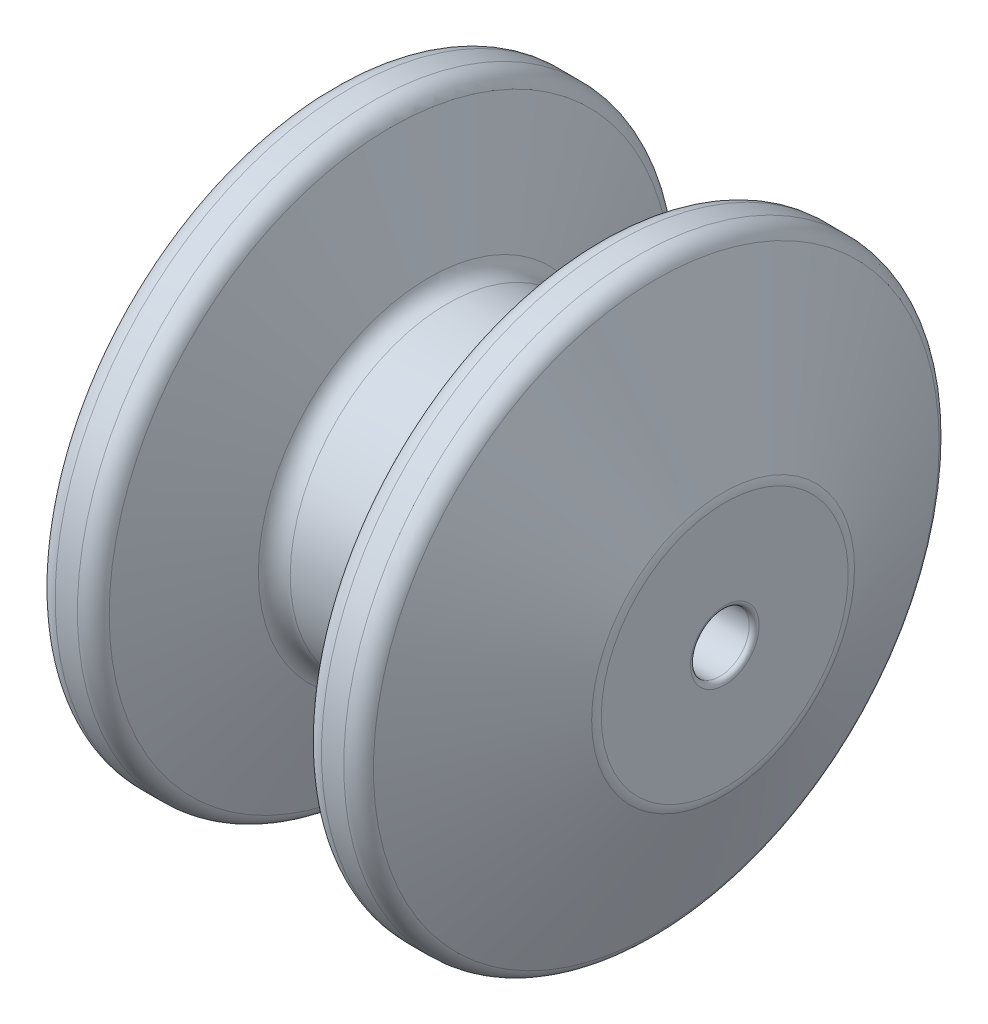
ISO-10303-21;
HEADER;
FILE_DESCRIPTION(('STEP AP214'),'2;1');
FILE_NAME('part.step','',(''),(''),'','','');
FILE_SCHEMA(('AUTOMOTIVE_DESIGN { 1 0 10303 214 1 1 1 1 }'));
ENDSEC;
DATA;
#1=APPLICATION_CONTEXT('core data for automotive mechanical design processes');
#2=APPLICATION_PROTOCOL_DEFINITION('international standard','automotive_design',2000,#1);
#3=PRODUCT_CONTEXT('',#1,'mechanical');
#4=PRODUCT('Part','Part','',(#3));
#5=PRODUCT_RELATED_PRODUCT_CATEGORY('part','',(#4));
#6=PRODUCT_DEFINITION_FORMATION('','',#4);
#7=PRODUCT_DEFINITION_CONTEXT('part definition',#1,'design');
#8=PRODUCT_DEFINITION('design','',#6,#7);
#9=PRODUCT_DEFINITION_SHAPE('','',#8);
#10=(LENGTH_UNIT() NAMED_UNIT(*) SI_UNIT(.MILLI.,.METRE.));
#11=(NAMED_UNIT(*) PLANE_ANGLE_UNIT() SI_UNIT($,.RADIAN.));
#12=(NAMED_UNIT(*) SI_UNIT($,.STERADIAN.) SOLID_ANGLE_UNIT());
#13=UNCERTAINTY_MEASURE_WITH_UNIT(LENGTH_MEASURE(1.E-05),#10,'distance_accuracy_value','');
#14=(GEOMETRIC_REPRESENTATION_CONTEXT(3) GLOBAL_UNCERTAINTY_ASSIGNED_CONTEXT((#13)) GLOBAL_UNIT_ASSIGNED_CONTEXT((#10,
#11,#12)) REPRESENTATION_CONTEXT('',''));
#15=CARTESIAN_POINT('',(0.,0.,0.));
#16=DIRECTION('',(0.,0.,1.));
#17=DIRECTION('',(1.,0.,0.));
#18=AXIS2_PLACEMENT_3D('',#15,#16,#17);
#19=CARTESIAN_POINT('',(11.,0.,0.));
#20=DIRECTION('',(1.,0.,0.));
#21=DIRECTION('',(0.,0.,-1.));
#22=AXIS2_PLACEMENT_3D('',#19,#20,#21);
#23=CONICAL_SURFACE('',#22,30.,1.23918376891598);
#24=CARTESIAN_POINT('',(6.64386442934935,0.,0.));
#25=DIRECTION('',(1.,0.,0.));
#26=DIRECTION('',(0.,0.,-1.));
#27=AXIS2_PLACEMENT_3D('',#24,#25,#26);
#28=CIRCLE('',#27,17.3488636910857);
#29=CARTESIAN_POINT('',(6.64386442934935,0.,-17.3488636910857));
#30=VERTEX_POINT('',#29);
#31=EDGE_CURVE('E105',#30,#30,#28,.T.);
#32=ORIENTED_EDGE('',*,*,#31,.T.);
#33=EDGE_LOOP('',(#32));
#34=FACE_BOUND('',#33,.T.);
#35=CARTESIAN_POINT('',(10.5355489845954,0.,0.));
#36=DIRECTION('',(-1.,0.,0.));
#37=DIRECTION('',(0.,0.,1.));
#38=AXIS2_PLACEMENT_3D('',#35,#36,#37);
#39=CIRCLE('',#38,28.6511363089143);
#40=CARTESIAN_POINT('',(10.5355489845954,0.,28.6511363089143));
#41=VERTEX_POINT('',#40);
#42=EDGE_CURVE('E108',#41,#41,#39,.T.);
#43=ORIENTED_EDGE('',*,*,#42,.T.);
#44=EDGE_LOOP('',(#43));
#45=FACE_BOUND('',#44,.T.);
#46=ADVANCED_FACE('F49',(#34,#45),#23,.T.);
#47=CARTESIAN_POINT('',(-29.0315789473684,0.,0.));
#48=DIRECTION('',(-1.,0.,0.));
#49=DIRECTION('',(0.,0.,1.));
#50=AXIS2_PLACEMENT_3D('',#47,#48,#49);
#51=CYLINDRICAL_SURFACE('',#50,30.);
#52=CARTESIAN_POINT('',(14.6963642145809,0.,0.));
#53=DIRECTION('',(1.,0.,0.));
#54=DIRECTION('',(0.,0.,-1.));
#55=AXIS2_PLACEMENT_3D('',#52,#53,#54);
#56=CIRCLE('',#55,30.);
#57=CARTESIAN_POINT('',(14.6963642145809,0.,-30.));
#58=VERTEX_POINT('',#57);
#59=EDGE_CURVE('E84',#58,#58,#56,.F.);
#60=ORIENTED_EDGE('',*,*,#59,.T.);
#61=EDGE_LOOP('',(#60));
#62=FACE_BOUND('',#61,.T.);
#63=CARTESIAN_POINT('',(12.426586135794,0.,0.));
#64=DIRECTION('',(1.,0.,0.));
#65=DIRECTION('',(0.,0.,-1.));
#66=AXIS2_PLACEMENT_3D('',#63,#64,#65);
#67=CIRCLE('',#66,30.);
#68=CARTESIAN_POINT('',(12.426586135794,0.,-30.));
#69=VERTEX_POINT('',#68);
#70=EDGE_CURVE('E87',#69,#69,#67,.T.);
#71=ORIENTED_EDGE('',*,*,#70,.T.);
#72=EDGE_LOOP('',(#71));
#73=FACE_BOUND('',#72,.T.);
#74=ADVANCED_FACE('F167',(#62,#73),#51,.T.);
#75=CARTESIAN_POINT('',(23.5,0.,0.));
#76=DIRECTION('',(-1.,0.,0.));
#77=DIRECTION('',(0.,0.,1.));
#78=AXIS2_PLACEMENT_3D('',#75,#76,#77);
#79=CONICAL_SURFACE('',#78,13.,1.15530423085401);
#80=CARTESIAN_POINT('',(23.3298356031459,0.,0.));
#81=DIRECTION('',(1.,0.,0.));
#82=DIRECTION('',(0.,0.,-1.));
#83=AXIS2_PLACEMENT_3D('',#80,#81,#82);
#84=CIRCLE('',#83,13.3857059662027);
#85=CARTESIAN_POINT('',(23.3298356031459,0.,-13.3857059662027));
#86=VERTEX_POINT('',#85);
#87=EDGE_CURVE('E93',#86,#86,#84,.F.);
#88=ORIENTED_EDGE('',*,*,#87,.T.);
#89=EDGE_LOOP('',(#88));
#90=FACE_BOUND('',#89,.T.);
#91=CARTESIAN_POINT('',(16.5261998177268,0.,0.));
#92=DIRECTION('',(1.,0.,0.));
#93=DIRECTION('',(0.,0.,-1.));
#94=AXIS2_PLACEMENT_3D('',#91,#92,#93);
#95=CIRCLE('',#94,28.8072804131526);
#96=CARTESIAN_POINT('',(16.5261998177268,0.,-28.8072804131526));
#97=VERTEX_POINT('',#96);
#98=EDGE_CURVE('E96',#97,#97,#95,.T.);
#99=ORIENTED_EDGE('',*,*,#98,.T.);
#100=EDGE_LOOP('',(#99));
#101=FACE_BOUND('',#100,.T.);
#102=ADVANCED_FACE('F174',(#90,#101),#79,.T.);
#103=CARTESIAN_POINT('',(23.5,3.,0.));
#104=DIRECTION('',(-1.,0.,0.));
#105=DIRECTION('',(0.,0.,1.));
#106=AXIS2_PLACEMENT_3D('',#103,#104,#105);
#107=PLANE('',#106);
#108=CARTESIAN_POINT('',(23.5,0.,0.));
#109=DIRECTION('',(-1.,0.,0.));
#110=DIRECTION('',(0.,0.,1.));
#111=AXIS2_PLACEMENT_3D('',#108,#109,#110);
#112=CIRCLE('',#111,3.5);
#113=CARTESIAN_POINT('',(23.5,0.,3.5));
#114=VERTEX_POINT('',#113);
#115=EDGE_CURVE('E64',#114,#114,#112,.T.);
#116=ORIENTED_EDGE('',*,*,#115,.T.);
#117=EDGE_LOOP('',(#116));
#118=FACE_BOUND('',#117,.T.);
#119=CARTESIAN_POINT('',(23.5,0.,0.));
#120=DIRECTION('',(-1.,0.,0.));
#121=DIRECTION('',(0.,0.,1.));
#122=AXIS2_PLACEMENT_3D('',#119,#120,#121);
#123=CIRCLE('',#122,12.5784255530501);
#124=CARTESIAN_POINT('',(23.5,0.,12.5784255530501));
#125=VERTEX_POINT('',#124);
#126=EDGE_CURVE('E90',#125,#125,#123,.F.);
#127=ORIENTED_EDGE('',*,*,#126,.T.);
#128=EDGE_LOOP('',(#127));
#129=FACE_BOUND('',#128,.T.);
#130=ADVANCED_FACE('F205',(#118,#129),#107,.F.);
#131=CARTESIAN_POINT('',(-29.0315789473684,0.,0.));
#132=DIRECTION('',(-1.,0.,0.));
#133=DIRECTION('',(0.,0.,1.));
#134=AXIS2_PLACEMENT_3D('',#131,#132,#133);
#135=CYLINDRICAL_SURFACE('',#134,3.);
#136=CARTESIAN_POINT('',(23.,0.,0.));
#137=DIRECTION('',(-1.,0.,0.));
#138=DIRECTION('',(0.,0.,1.));
#139=AXIS2_PLACEMENT_3D('',#136,#137,#138);
#140=CIRCLE('',#139,3.);
#141=CARTESIAN_POINT('',(23.,0.,3.));
#142=VERTEX_POINT('',#141);
#143=EDGE_CURVE('E56',#142,#142,#140,.F.);
#144=ORIENTED_EDGE('',*,*,#143,.T.);
#145=EDGE_LOOP('',(#144));
#146=FACE_BOUND('',#145,.T.);
#147=CARTESIAN_POINT('',(-23.,0.,0.));
#148=DIRECTION('',(1.,0.,0.));
#149=DIRECTION('',(0.,0.,-1.));
#150=AXIS2_PLACEMENT_3D('',#147,#148,#149);
#151=CIRCLE('',#150,3.);
#152=CARTESIAN_POINT('',(-23.,0.,-3.));
#153=VERTEX_POINT('',#152);
#154=EDGE_CURVE('E60',#153,#153,#151,.F.);
#155=ORIENTED_EDGE('',*,*,#154,.T.);
#156=EDGE_LOOP('',(#155));
#157=FACE_BOUND('',#156,.T.);
#158=ADVANCED_FACE('F164',(#146,#157),#135,.F.);
#159=CARTESIAN_POINT('',(-23.5,3.,0.));
#160=DIRECTION('',(1.,0.,0.));
#161=DIRECTION('',(0.,0.,-1.));
#162=AXIS2_PLACEMENT_3D('',#159,#160,#161);
#163=PLANE('',#162);
#164=CARTESIAN_POINT('',(-23.5,0.,0.));
#165=DIRECTION('',(1.,0.,0.));
#166=DIRECTION('',(0.,0.,-1.));
#167=AXIS2_PLACEMENT_3D('',#164,#165,#166);
#168=CIRCLE('',#167,3.5);
#169=CARTESIAN_POINT('',(-23.5,0.,-3.5));
#170=VERTEX_POINT('',#169);
#171=EDGE_CURVE('E11',#170,#170,#168,.T.);
#172=ORIENTED_EDGE('',*,*,#171,.T.);
#173=EDGE_LOOP('',(#172));
#174=FACE_BOUND('',#173,.T.);
#175=CARTESIAN_POINT('',(-23.5,0.,0.));
#176=DIRECTION('',(1.,0.,0.));
#177=DIRECTION('',(0.,0.,-1.));
#178=AXIS2_PLACEMENT_3D('',#175,#176,#177);
#179=CIRCLE('',#178,12.5784255530501);
#180=CARTESIAN_POINT('',(-23.5,0.,-12.5784255530501));
#181=VERTEX_POINT('',#180);
#182=EDGE_CURVE('E75',#181,#181,#179,.F.);
#183=ORIENTED_EDGE('',*,*,#182,.T.);
#184=EDGE_LOOP('',(#183));
#185=FACE_BOUND('',#184,.T.);
#186=ADVANCED_FACE('F157',(#174,#185),#163,.F.);
#187=CARTESIAN_POINT('',(-16.,0.,0.));
#188=DIRECTION('',(1.,0.,0.));
#189=DIRECTION('',(0.,0.,-1.));
#190=AXIS2_PLACEMENT_3D('',#187,#188,#189);
#191=CONICAL_SURFACE('',#190,30.,1.15530423085401);
#192=CARTESIAN_POINT('',(-23.3298356031459,0.,0.));
#193=DIRECTION('',(-1.,0.,0.));
#194=DIRECTION('',(0.,0.,1.));
#195=AXIS2_PLACEMENT_3D('',#192,#193,#194);
#196=CIRCLE('',#195,13.3857059662027);
#197=CARTESIAN_POINT('',(-23.3298356031459,0.,13.3857059662027));
#198=VERTEX_POINT('',#197);
#199=EDGE_CURVE('E69',#198,#198,#196,.F.);
#200=ORIENTED_EDGE('',*,*,#199,.T.);
#201=EDGE_LOOP('',(#200));
#202=FACE_BOUND('',#201,.T.);
#203=CARTESIAN_POINT('',(-16.5261998177268,0.,0.));
#204=DIRECTION('',(-1.,0.,0.));
#205=DIRECTION('',(0.,0.,1.));
#206=AXIS2_PLACEMENT_3D('',#203,#204,#205);
#207=CIRCLE('',#206,28.8072804131526);
#208=CARTESIAN_POINT('',(-16.5261998177268,0.,28.8072804131526));
#209=VERTEX_POINT('',#208);
#210=EDGE_CURVE('E72',#209,#209,#207,.T.);
#211=ORIENTED_EDGE('',*,*,#210,.T.);
#212=EDGE_LOOP('',(#211));
#213=FACE_BOUND('',#212,.T.);
#214=ADVANCED_FACE('F145',(#202,#213),#191,.T.);
#215=CARTESIAN_POINT('',(-29.0315789473684,0.,0.));
#216=DIRECTION('',(-1.,0.,0.));
#217=DIRECTION('',(0.,0.,1.));
#218=AXIS2_PLACEMENT_3D('',#215,#216,#217);
#219=CYLINDRICAL_SURFACE('',#218,30.);
#220=CARTESIAN_POINT('',(-12.426586135794,0.,0.));
#221=DIRECTION('',(1.,0.,0.));
#222=DIRECTION('',(0.,0.,-1.));
#223=AXIS2_PLACEMENT_3D('',#220,#221,#222);
#224=CIRCLE('',#223,30.);
#225=CARTESIAN_POINT('',(-12.426586135794,0.,-30.));
#226=VERTEX_POINT('',#225);
#227=EDGE_CURVE('E78',#226,#226,#224,.F.);
#228=ORIENTED_EDGE('',*,*,#227,.T.);
#229=EDGE_LOOP('',(#228));
#230=FACE_BOUND('',#229,.T.);
#231=CARTESIAN_POINT('',(-14.6963642145809,0.,0.));
#232=DIRECTION('',(1.,0.,0.));
#233=DIRECTION('',(0.,0.,-1.));
#234=AXIS2_PLACEMENT_3D('',#231,#232,#233);
#235=CIRCLE('',#234,30.);
#236=CARTESIAN_POINT('',(-14.6963642145809,0.,-30.));
#237=VERTEX_POINT('',#236);
#238=EDGE_CURVE('E81',#237,#237,#235,.T.);
#239=ORIENTED_EDGE('',*,*,#238,.T.);
#240=EDGE_LOOP('',(#239));
#241=FACE_BOUND('',#240,.T.);
#242=ADVANCED_FACE('F131',(#230,#241),#219,.T.);
#243=CARTESIAN_POINT('',(-6.17941341394473,0.,0.));
#244=DIRECTION('',(-1.,0.,0.));
#245=DIRECTION('',(0.,0.,1.));
#246=AXIS2_PLACEMENT_3D('',#243,#244,#245);
#247=CONICAL_SURFACE('',#246,16.,1.23918376891598);
#248=CARTESIAN_POINT('',(-6.64386442934935,0.,0.));
#249=DIRECTION('',(-1.,0.,0.));
#250=DIRECTION('',(0.,0.,1.));
#251=AXIS2_PLACEMENT_3D('',#248,#249,#250);
#252=CIRCLE('',#251,17.3488636910857);
#253=CARTESIAN_POINT('',(-6.64386442934935,0.,17.3488636910857));
#254=VERTEX_POINT('',#253);
#255=EDGE_CURVE('E99',#254,#254,#252,.T.);
#256=ORIENTED_EDGE('',*,*,#255,.T.);
#257=EDGE_LOOP('',(#256));
#258=FACE_BOUND('',#257,.T.);
#259=CARTESIAN_POINT('',(-10.5355489845954,0.,0.));
#260=DIRECTION('',(1.,0.,0.));
#261=DIRECTION('',(0.,0.,-1.));
#262=AXIS2_PLACEMENT_3D('',#259,#260,#261);
#263=CIRCLE('',#262,28.6511363089143);
#264=CARTESIAN_POINT('',(-10.5355489845954,0.,-28.6511363089143));
#265=VERTEX_POINT('',#264);
#266=EDGE_CURVE('E102',#265,#265,#263,.T.);
#267=ORIENTED_EDGE('',*,*,#266,.T.);
#268=EDGE_LOOP('',(#267));
#269=FACE_BOUND('',#268,.T.);
#270=ADVANCED_FACE('F128',(#258,#269),#247,.T.);
#271=CARTESIAN_POINT('',(-29.0315789473684,0.,0.));
#272=DIRECTION('',(-1.,0.,0.));
#273=DIRECTION('',(0.,0.,1.));
#274=AXIS2_PLACEMENT_3D('',#271,#272,#273);
#275=CYLINDRICAL_SURFACE('',#274,16.);
#276=CARTESIAN_POINT('',(4.75282727815072,0.,0.));
#277=DIRECTION('',(-1.,0.,0.));
#278=DIRECTION('',(0.,0.,1.));
#279=AXIS2_PLACEMENT_3D('',#276,#277,#278);
#280=CIRCLE('',#279,16.);
#281=CARTESIAN_POINT('',(4.75282727815072,0.,16.));
#282=VERTEX_POINT('',#281);
#283=EDGE_CURVE('E111',#282,#282,#280,.T.);
#284=ORIENTED_EDGE('',*,*,#283,.T.);
#285=EDGE_LOOP('',(#284));
#286=FACE_BOUND('',#285,.T.);
#287=CARTESIAN_POINT('',(-4.75282727815072,0.,0.));
#288=DIRECTION('',(-1.,0.,0.));
#289=DIRECTION('',(0.,0.,1.));
#290=AXIS2_PLACEMENT_3D('',#287,#288,#289);
#291=CIRCLE('',#290,16.);
#292=CARTESIAN_POINT('',(-4.75282727815072,0.,16.));
#293=VERTEX_POINT('',#292);
#294=EDGE_CURVE('E114',#293,#293,#291,.F.);
#295=ORIENTED_EDGE('',*,*,#294,.T.);
#296=EDGE_LOOP('',(#295));
#297=FACE_BOUND('',#296,.T.);
#298=ADVANCED_FACE('F118',(#286,#297),#275,.T.);
#299=CARTESIAN_POINT('',(4.75282727815072,0.,0.));
#300=DIRECTION('',(-1.,0.,0.));
#301=DIRECTION('',(0.,0.,1.));
#302=AXIS2_PLACEMENT_3D('',#299,#300,#301);
#303=TOROIDAL_SURFACE('',#302,18.,2.);
#304=ORIENTED_EDGE('',*,*,#31,.F.);
#305=EDGE_LOOP('',(#304));
#306=FACE_BOUND('',#305,.T.);
#307=ORIENTED_EDGE('',*,*,#283,.F.);
#308=EDGE_LOOP('',(#307));
#309=FACE_BOUND('',#308,.T.);
#310=ADVANCED_FACE('F124',(#306,#309),#303,.F.);
#311=CARTESIAN_POINT('',(-4.75282727815072,0.,0.));
#312=DIRECTION('',(-1.,0.,0.));
#313=DIRECTION('',(0.,0.,1.));
#314=AXIS2_PLACEMENT_3D('',#311,#312,#313);
#315=TOROIDAL_SURFACE('',#314,18.,2.);
#316=ORIENTED_EDGE('',*,*,#294,.F.);
#317=EDGE_LOOP('',(#316));
#318=FACE_BOUND('',#317,.T.);
#319=ORIENTED_EDGE('',*,*,#255,.F.);
#320=EDGE_LOOP('',(#319));
#321=FACE_BOUND('',#320,.T.);
#322=ADVANCED_FACE('F120',(#318,#321),#315,.F.);
#323=CARTESIAN_POINT('',(21.5,0.,0.));
#324=DIRECTION('',(-1.,0.,0.));
#325=DIRECTION('',(0.,0.,1.));
#326=AXIS2_PLACEMENT_3D('',#323,#324,#325);
#327=TOROIDAL_SURFACE('',#326,12.5784255530501,2.);
#328=ORIENTED_EDGE('',*,*,#126,.F.);
#329=EDGE_LOOP('',(#328));
#330=FACE_BOUND('',#329,.T.);
#331=ORIENTED_EDGE('',*,*,#87,.F.);
#332=EDGE_LOOP('',(#331));
#333=FACE_BOUND('',#332,.T.);
#334=ADVANCED_FACE('F123',(#330,#333),#327,.T.);
#335=CARTESIAN_POINT('',(14.6963642145809,0.,0.));
#336=DIRECTION('',(1.,0.,0.));
#337=DIRECTION('',(0.,0.,-1.));
#338=AXIS2_PLACEMENT_3D('',#335,#336,#337);
#339=TOROIDAL_SURFACE('',#338,28.,2.);
#340=ORIENTED_EDGE('',*,*,#98,.F.);
#341=EDGE_LOOP('',(#340));
#342=FACE_BOUND('',#341,.T.);
#343=ORIENTED_EDGE('',*,*,#59,.F.);
#344=EDGE_LOOP('',(#343));
#345=FACE_BOUND('',#344,.T.);
#346=ADVANCED_FACE('F185',(#342,#345),#339,.T.);
#347=CARTESIAN_POINT('',(12.426586135794,0.,0.));
#348=DIRECTION('',(1.,0.,0.));
#349=DIRECTION('',(0.,0.,-1.));
#350=AXIS2_PLACEMENT_3D('',#347,#348,#349);
#351=TOROIDAL_SURFACE('',#350,28.,2.);
#352=ORIENTED_EDGE('',*,*,#70,.F.);
#353=EDGE_LOOP('',(#352));
#354=FACE_BOUND('',#353,.T.);
#355=ORIENTED_EDGE('',*,*,#42,.F.);
#356=EDGE_LOOP('',(#355));
#357=FACE_BOUND('',#356,.T.);
#358=ADVANCED_FACE('F139',(#354,#357),#351,.T.);
#359=CARTESIAN_POINT('',(-12.426586135794,0.,0.));
#360=DIRECTION('',(1.,0.,0.));
#361=DIRECTION('',(0.,0.,-1.));
#362=AXIS2_PLACEMENT_3D('',#359,#360,#361);
#363=TOROIDAL_SURFACE('',#362,28.,2.);
#364=ORIENTED_EDGE('',*,*,#266,.F.);
#365=EDGE_LOOP('',(#364));
#366=FACE_BOUND('',#365,.T.);
#367=ORIENTED_EDGE('',*,*,#227,.F.);
#368=EDGE_LOOP('',(#367));
#369=FACE_BOUND('',#368,.T.);
#370=ADVANCED_FACE('F135',(#366,#369),#363,.T.);
#371=CARTESIAN_POINT('',(-21.5,0.,0.));
#372=DIRECTION('',(1.,0.,0.));
#373=DIRECTION('',(0.,0.,-1.));
#374=AXIS2_PLACEMENT_3D('',#371,#372,#373);
#375=TOROIDAL_SURFACE('',#374,12.5784255530501,2.);
#376=ORIENTED_EDGE('',*,*,#199,.F.);
#377=EDGE_LOOP('',(#376));
#378=FACE_BOUND('',#377,.T.);
#379=ORIENTED_EDGE('',*,*,#182,.F.);
#380=EDGE_LOOP('',(#379));
#381=FACE_BOUND('',#380,.T.);
#382=ADVANCED_FACE('F138',(#378,#381),#375,.T.);
#383=CARTESIAN_POINT('',(-14.6963642145809,0.,0.));
#384=DIRECTION('',(1.,0.,0.));
#385=DIRECTION('',(0.,0.,-1.));
#386=AXIS2_PLACEMENT_3D('',#383,#384,#385);
#387=TOROIDAL_SURFACE('',#386,28.,2.);
#388=ORIENTED_EDGE('',*,*,#238,.F.);
#389=EDGE_LOOP('',(#388));
#390=FACE_BOUND('',#389,.T.);
#391=ORIENTED_EDGE('',*,*,#210,.F.);
#392=EDGE_LOOP('',(#391));
#393=FACE_BOUND('',#392,.T.);
#394=ADVANCED_FACE('F149',(#390,#393),#387,.T.);
#395=CARTESIAN_POINT('',(23.,0.,0.));
#396=DIRECTION('',(-1.,0.,0.));
#397=DIRECTION('',(0.,0.,1.));
#398=AXIS2_PLACEMENT_3D('',#395,#396,#397);
#399=TOROIDAL_SURFACE('',#398,3.5,0.5);
#400=ORIENTED_EDGE('',*,*,#143,.F.);
#401=EDGE_LOOP('',(#400));
#402=FACE_BOUND('',#401,.T.);
#403=ORIENTED_EDGE('',*,*,#115,.F.);
#404=EDGE_LOOP('',(#403));
#405=FACE_BOUND('',#404,.T.);
#406=ADVANCED_FACE('F152',(#402,#405),#399,.T.);
#407=CARTESIAN_POINT('',(-23.,0.,0.));
#408=DIRECTION('',(1.,0.,0.));
#409=DIRECTION('',(0.,0.,-1.));
#410=AXIS2_PLACEMENT_3D('',#407,#408,#409);
#411=TOROIDAL_SURFACE('',#410,3.5,0.5);
#412=ORIENTED_EDGE('',*,*,#171,.F.);
#413=EDGE_LOOP('',(#412));
#414=FACE_BOUND('',#413,.T.);
#415=ORIENTED_EDGE('',*,*,#154,.F.);
#416=EDGE_LOOP('',(#415));
#417=FACE_BOUND('',#416,.T.);
#418=ADVANCED_FACE('F51',(#414,#417),#411,.T.);
#419=CLOSED_SHELL('',(#46,#74,#102,#130,#158,#186,#214,#242,#270,#298,#310,#322,#334,#346,#358,
#370,#382,#394,#406,#418));
#420=MANIFOLD_SOLID_BREP('B2',#419);
#421=ADVANCED_BREP_SHAPE_REPRESENTATION('',(#18,#420),#14);
#422=SHAPE_DEFINITION_REPRESENTATION(#9,#421);
ENDSEC;
END-ISO-10303-21;
